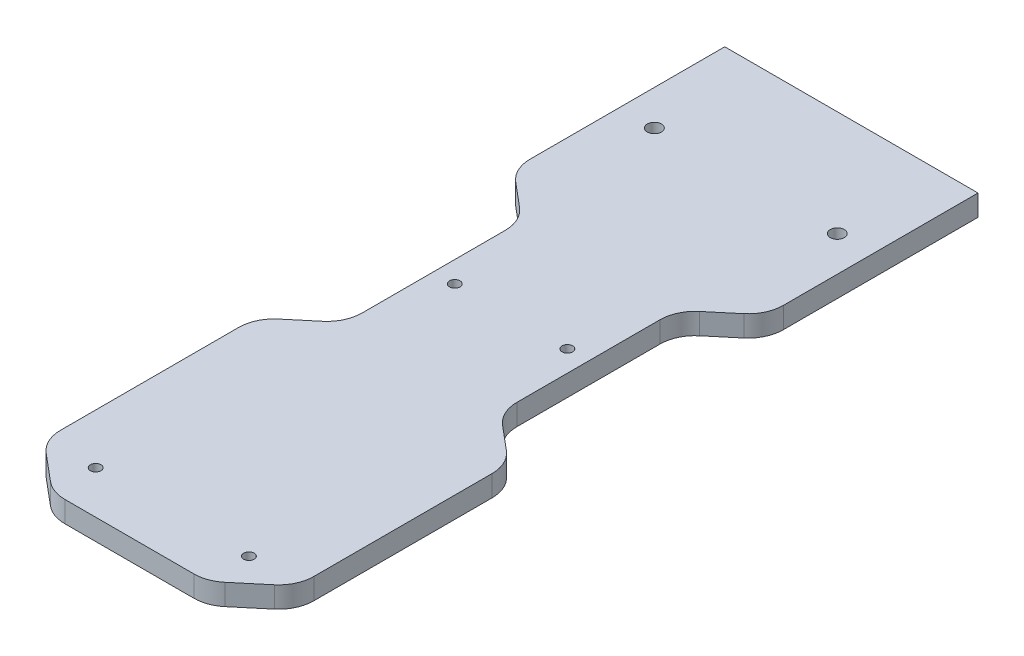
ISO-10303-21;
HEADER;
FILE_DESCRIPTION(('STEP AP214'),'2;1');
FILE_NAME('part.step','',(''),(''),'','','');
FILE_SCHEMA(('AUTOMOTIVE_DESIGN { 1 0 10303 214 1 1 1 1 }'));
ENDSEC;
DATA;
#1=APPLICATION_CONTEXT('core data for automotive mechanical design processes');
#2=APPLICATION_PROTOCOL_DEFINITION('international standard','automotive_design',2000,#1);
#3=PRODUCT_CONTEXT('',#1,'mechanical');
#4=PRODUCT('Part','Part','',(#3));
#5=PRODUCT_RELATED_PRODUCT_CATEGORY('part','',(#4));
#6=PRODUCT_DEFINITION_FORMATION('','',#4);
#7=PRODUCT_DEFINITION_CONTEXT('part definition',#1,'design');
#8=PRODUCT_DEFINITION('design','',#6,#7);
#9=PRODUCT_DEFINITION_SHAPE('','',#8);
#10=(LENGTH_UNIT() NAMED_UNIT(*) SI_UNIT(.MILLI.,.METRE.));
#11=(NAMED_UNIT(*) PLANE_ANGLE_UNIT() SI_UNIT($,.RADIAN.));
#12=(NAMED_UNIT(*) SI_UNIT($,.STERADIAN.) SOLID_ANGLE_UNIT());
#13=UNCERTAINTY_MEASURE_WITH_UNIT(LENGTH_MEASURE(1.E-05),#10,'distance_accuracy_value','');
#14=(GEOMETRIC_REPRESENTATION_CONTEXT(3) GLOBAL_UNCERTAINTY_ASSIGNED_CONTEXT((#13)) GLOBAL_UNIT_ASSIGNED_CONTEXT((#10,
#11,#12)) REPRESENTATION_CONTEXT('',''));
#15=CARTESIAN_POINT('',(0.,0.,0.));
#16=DIRECTION('',(0.,0.,1.));
#17=DIRECTION('',(1.,0.,0.));
#18=AXIS2_PLACEMENT_3D('',#15,#16,#17);
#19=CARTESIAN_POINT('',(-22.7869169844529,6.,102.227633762496));
#20=DIRECTION('',(0.,0.,-1.));
#21=DIRECTION('',(-1.,0.,0.));
#22=AXIS2_PLACEMENT_3D('',#19,#20,#21);
#23=PLANE('',#22);
#24=DIRECTION('',(1.,0.,0.));
#25=VECTOR('',#24,1.);
#26=CARTESIAN_POINT('',(-22.7869169844529,0.,102.227633762496));
#27=LINE('',#26,#25);
#28=CARTESIAN_POINT('',(-19.1472146417909,0.,102.227633762496));
#29=VERTEX_POINT('',#28);
#30=CARTESIAN_POINT('',(17.573380672885,0.,102.227633762496));
#31=VERTEX_POINT('',#30);
#32=EDGE_CURVE('E251',#29,#31,#27,.T.);
#33=ORIENTED_EDGE('',*,*,#32,.T.);
#34=DIRECTION('',(0.,-1.,0.));
#35=VECTOR('',#34,1.);
#36=CARTESIAN_POINT('',(17.573380672885,6.,102.227633762496));
#37=LINE('',#36,#35);
#38=CARTESIAN_POINT('',(17.573380672885,6.,102.227633762496));
#39=VERTEX_POINT('',#38);
#40=EDGE_CURVE('E348',#31,#39,#37,.F.);
#41=ORIENTED_EDGE('',*,*,#40,.T.);
#42=DIRECTION('',(1.,0.,0.));
#43=VECTOR('',#42,1.);
#44=CARTESIAN_POINT('',(-22.7869169844529,6.,102.227633762496));
#45=LINE('',#44,#43);
#46=CARTESIAN_POINT('',(-19.1472146417909,6.,102.227633762496));
#47=VERTEX_POINT('',#46);
#48=EDGE_CURVE('E289',#47,#39,#45,.T.);
#49=ORIENTED_EDGE('',*,*,#48,.F.);
#50=DIRECTION('',(0.,-1.,0.));
#51=VECTOR('',#50,1.);
#52=CARTESIAN_POINT('',(-19.1472146417909,6.,102.227633762496));
#53=LINE('',#52,#51);
#54=EDGE_CURVE('E345',#47,#29,#53,.T.);
#55=ORIENTED_EDGE('',*,*,#54,.T.);
#56=EDGE_LOOP('',(#33,#41,#49,#55));
#57=FACE_BOUND('',#56,.T.);
#58=ADVANCED_FACE('F32',(#57),#23,.F.);
#59=CARTESIAN_POINT('',(21.2130830155471,6.,102.227633762496));
#60=DIRECTION('',(-0.642787609686539,0.,-0.766044443118979));
#61=DIRECTION('',(-0.766044443118979,0.,0.642787609686539));
#62=AXIS2_PLACEMENT_3D('',#59,#60,#61);
#63=PLANE('',#62);
#64=DIRECTION('',(0.766044443118978,0.,-0.642787609686539));
#65=VECTOR('',#64,1.);
#66=CARTESIAN_POINT('',(21.2130830155471,0.,102.227633762496));
#67=LINE('',#66,#65);
#68=CARTESIAN_POINT('',(24.0012567697504,0.,99.8880781936862));
#69=VERTEX_POINT('',#68);
#70=CARTESIAN_POINT('',(31.6409591124124,0.,93.4776067756543));
#71=VERTEX_POINT('',#70);
#72=EDGE_CURVE('E254',#69,#71,#67,.T.);
#73=ORIENTED_EDGE('',*,*,#72,.T.);
#74=DIRECTION('',(0.,-1.,0.));
#75=VECTOR('',#74,1.);
#76=CARTESIAN_POINT('',(31.6409591124124,6.,93.4776067756543));
#77=LINE('',#76,#75);
#78=CARTESIAN_POINT('',(31.6409591124124,6.,93.4776067756543));
#79=VERTEX_POINT('',#78);
#80=EDGE_CURVE('E343',#71,#79,#77,.F.);
#81=ORIENTED_EDGE('',*,*,#80,.T.);
#82=DIRECTION('',(0.766044443118978,0.,-0.642787609686539));
#83=VECTOR('',#82,1.);
#84=CARTESIAN_POINT('',(21.2130830155471,6.,102.227633762496));
#85=LINE('',#84,#83);
#86=CARTESIAN_POINT('',(24.0012567697504,6.,99.8880781936862));
#87=VERTEX_POINT('',#86);
#88=EDGE_CURVE('E423',#87,#79,#85,.T.);
#89=ORIENTED_EDGE('',*,*,#88,.F.);
#90=DIRECTION('',(0.,-1.,0.));
#91=VECTOR('',#90,1.);
#92=CARTESIAN_POINT('',(24.0012567697504,6.,99.8880781936862));
#93=LINE('',#92,#91);
#94=EDGE_CURVE('E340',#87,#69,#93,.T.);
#95=ORIENTED_EDGE('',*,*,#94,.T.);
#96=EDGE_LOOP('',(#73,#81,#89,#95));
#97=FACE_BOUND('',#96,.T.);
#98=ADVANCED_FACE('F502',(#97),#63,.F.);
#99=CARTESIAN_POINT('',(35.213083015547,6.,90.4802389260145));
#100=DIRECTION('',(-1.,0.,0.));
#101=DIRECTION('',(0.,0.,1.));
#102=AXIS2_PLACEMENT_3D('',#99,#100,#101);
#103=PLANE('',#102);
#104=DIRECTION('',(0.,0.,-1.));
#105=VECTOR('',#104,1.);
#106=CARTESIAN_POINT('',(35.213083015547,0.,90.4802389260145));
#107=LINE('',#106,#105);
#108=CARTESIAN_POINT('',(35.213083015547,0.,85.8171623444645));
#109=VERTEX_POINT('',#108);
#110=CARTESIAN_POINT('',(35.2130830155471,0.,35.1433155075645));
#111=VERTEX_POINT('',#110);
#112=EDGE_CURVE('E258',#109,#111,#107,.T.);
#113=ORIENTED_EDGE('',*,*,#112,.T.);
#114=DIRECTION('',(0.,-1.,0.));
#115=VECTOR('',#114,1.);
#116=CARTESIAN_POINT('',(35.2130830155471,6.,35.1433155075645));
#117=LINE('',#116,#115);
#118=CARTESIAN_POINT('',(35.2130830155471,6.,35.1433155075645));
#119=VERTEX_POINT('',#118);
#120=EDGE_CURVE('E310',#111,#119,#117,.F.);
#121=ORIENTED_EDGE('',*,*,#120,.T.);
#122=DIRECTION('',(0.,0.,-1.));
#123=VECTOR('',#122,1.);
#124=CARTESIAN_POINT('',(35.213083015547,6.,90.4802389260145));
#125=LINE('',#124,#123);
#126=CARTESIAN_POINT('',(35.213083015547,6.,85.8171623444645));
#127=VERTEX_POINT('',#126);
#128=EDGE_CURVE('E426',#127,#119,#125,.T.);
#129=ORIENTED_EDGE('',*,*,#128,.F.);
#130=DIRECTION('',(0.,-1.,0.));
#131=VECTOR('',#130,1.);
#132=CARTESIAN_POINT('',(35.213083015547,6.,85.8171623444645));
#133=LINE('',#132,#131);
#134=EDGE_CURVE('E307',#127,#109,#133,.T.);
#135=ORIENTED_EDGE('',*,*,#134,.T.);
#136=EDGE_LOOP('',(#113,#121,#129,#135));
#137=FACE_BOUND('',#136,.T.);
#138=ADVANCED_FACE('F511',(#137),#103,.F.);
#139=CARTESIAN_POINT('',(35.2130830155471,6.,30.4802389260145));
#140=DIRECTION('',(-0.642787609686539,0.,0.766044443118978));
#141=DIRECTION('',(0.766044443118978,0.,0.642787609686539));
#142=AXIS2_PLACEMENT_3D('',#139,#140,#141);
#143=PLANE('',#142);
#144=DIRECTION('',(-0.766044443118978,0.,-0.642787609686539));
#145=VECTOR('',#144,1.);
#146=CARTESIAN_POINT('',(35.2130830155471,6.,30.4802389260145));
#147=LINE('',#146,#145);
#148=CARTESIAN_POINT('',(31.6409591124125,6.,27.4828710763747));
#149=VERTEX_POINT('',#148);
#150=CARTESIAN_POINT('',(24.7852069186817,6.,21.7302119391724));
#151=VERTEX_POINT('',#150);
#152=EDGE_CURVE('E429',#149,#151,#147,.T.);
#153=ORIENTED_EDGE('',*,*,#152,.F.);
#154=DIRECTION('',(0.,-1.,0.));
#155=VECTOR('',#154,1.);
#156=CARTESIAN_POINT('',(31.6409591124125,6.,27.4828710763747));
#157=LINE('',#156,#155);
#158=CARTESIAN_POINT('',(31.6409591124125,0.,27.4828710763747));
#159=VERTEX_POINT('',#158);
#160=EDGE_CURVE('E292',#149,#159,#157,.T.);
#161=ORIENTED_EDGE('',*,*,#160,.T.);
#162=DIRECTION('',(-0.766044443118978,0.,-0.642787609686539));
#163=VECTOR('',#162,1.);
#164=CARTESIAN_POINT('',(35.2130830155471,0.,30.4802389260145));
#165=LINE('',#164,#163);
#166=CARTESIAN_POINT('',(24.7852069186817,0.,21.7302119391724));
#167=VERTEX_POINT('',#166);
#168=EDGE_CURVE('E261',#159,#167,#165,.T.);
#169=ORIENTED_EDGE('',*,*,#168,.T.);
#170=DIRECTION('',(0.,-1.,0.));
#171=VECTOR('',#170,1.);
#172=CARTESIAN_POINT('',(24.7852069186817,6.,21.7302119391724));
#173=LINE('',#172,#171);
#174=EDGE_CURVE('E227',#167,#151,#173,.F.);
#175=ORIENTED_EDGE('',*,*,#174,.T.);
#176=EDGE_LOOP('',(#153,#161,#169,#175));
#177=FACE_BOUND('',#176,.T.);
#178=ADVANCED_FACE('F520',(#177),#143,.F.);
#179=CARTESIAN_POINT('',(21.2130830155471,6.,18.7328440895326));
#180=DIRECTION('',(-1.,0.,0.));
#181=DIRECTION('',(0.,0.,1.));
#182=AXIS2_PLACEMENT_3D('',#179,#180,#181);
#183=PLANE('',#182);
#184=DIRECTION('',(0.,0.,-1.));
#185=VECTOR('',#184,1.);
#186=CARTESIAN_POINT('',(21.2130830155471,0.,18.7328440895326));
#187=LINE('',#186,#185);
#188=CARTESIAN_POINT('',(21.2130830155471,0.,14.0697675079826));
#189=VERTEX_POINT('',#188);
#190=CARTESIAN_POINT('',(21.2130830155471,0.,-26.6040793289174));
#191=VERTEX_POINT('',#190);
#192=EDGE_CURVE('E264',#189,#191,#187,.T.);
#193=ORIENTED_EDGE('',*,*,#192,.T.);
#194=DIRECTION('',(0.,-1.,0.));
#195=VECTOR('',#194,1.);
#196=CARTESIAN_POINT('',(21.2130830155471,6.,-26.6040793289174));
#197=LINE('',#196,#195);
#198=CARTESIAN_POINT('',(21.2130830155471,6.,-26.6040793289174));
#199=VERTEX_POINT('',#198);
#200=EDGE_CURVE('E384',#191,#199,#197,.F.);
#201=ORIENTED_EDGE('',*,*,#200,.T.);
#202=DIRECTION('',(0.,0.,-1.));
#203=VECTOR('',#202,1.);
#204=CARTESIAN_POINT('',(21.2130830155471,6.,18.7328440895326));
#205=LINE('',#204,#203);
#206=CARTESIAN_POINT('',(21.2130830155471,6.,14.0697675079826));
#207=VERTEX_POINT('',#206);
#208=EDGE_CURVE('E432',#207,#199,#205,.T.);
#209=ORIENTED_EDGE('',*,*,#208,.F.);
#210=DIRECTION('',(0.,-1.,0.));
#211=VECTOR('',#210,1.);
#212=CARTESIAN_POINT('',(21.2130830155471,0.,14.0697675079826));
#213=LINE('',#212,#211);
#214=EDGE_CURVE('E324',#207,#189,#213,.T.);
#215=ORIENTED_EDGE('',*,*,#214,.T.);
#216=EDGE_LOOP('',(#193,#201,#209,#215));
#217=FACE_BOUND('',#216,.T.);
#218=ADVANCED_FACE('F528',(#217),#183,.F.);
#219=CARTESIAN_POINT('',(21.2130830155471,6.,-31.2671559104674));
#220=DIRECTION('',(-0.642787609686539,0.,-0.766044443118978));
#221=DIRECTION('',(-0.766044443118978,0.,0.642787609686539));
#222=AXIS2_PLACEMENT_3D('',#219,#220,#221);
#223=PLANE('',#222);
#224=DIRECTION('',(0.766044443118978,0.,-0.642787609686539));
#225=VECTOR('',#224,1.);
#226=CARTESIAN_POINT('',(21.2130830155471,0.,-31.2671559104674));
#227=LINE('',#226,#225);
#228=CARTESIAN_POINT('',(24.7852069186817,0.,-34.2645237601072));
#229=VERTEX_POINT('',#228);
#230=CARTESIAN_POINT('',(31.6409591124124,0.,-40.0171828973095));
#231=VERTEX_POINT('',#230);
#232=EDGE_CURVE('E267',#229,#231,#227,.T.);
#233=ORIENTED_EDGE('',*,*,#232,.T.);
#234=DIRECTION('',(0.,-1.,0.));
#235=VECTOR('',#234,1.);
#236=CARTESIAN_POINT('',(31.6409591124124,6.,-40.0171828973095));
#237=LINE('',#236,#235);
#238=CARTESIAN_POINT('',(31.6409591124124,6.,-40.0171828973095));
#239=VERTEX_POINT('',#238);
#240=EDGE_CURVE('E373',#231,#239,#237,.F.);
#241=ORIENTED_EDGE('',*,*,#240,.T.);
#242=DIRECTION('',(0.766044443118978,0.,-0.642787609686539));
#243=VECTOR('',#242,1.);
#244=CARTESIAN_POINT('',(21.2130830155471,6.,-31.2671559104674));
#245=LINE('',#244,#243);
#246=CARTESIAN_POINT('',(24.7852069186817,6.,-34.2645237601072));
#247=VERTEX_POINT('',#246);
#248=EDGE_CURVE('E218',#247,#239,#245,.T.);
#249=ORIENTED_EDGE('',*,*,#248,.F.);
#250=DIRECTION('',(0.,-1.,0.));
#251=VECTOR('',#250,1.);
#252=CARTESIAN_POINT('',(24.7852069186817,0.,-34.2645237601072));
#253=LINE('',#252,#251);
#254=EDGE_CURVE('E370',#247,#229,#253,.T.);
#255=ORIENTED_EDGE('',*,*,#254,.T.);
#256=EDGE_LOOP('',(#233,#241,#249,#255));
#257=FACE_BOUND('',#256,.T.);
#258=ADVANCED_FACE('F533',(#257),#223,.F.);
#259=CARTESIAN_POINT('',(35.213083015547,6.,-43.0145507469493));
#260=DIRECTION('',(-1.,0.,0.));
#261=DIRECTION('',(0.,0.,1.));
#262=AXIS2_PLACEMENT_3D('',#259,#260,#261);
#263=PLANE('',#262);
#264=DIRECTION('',(0.,0.,-1.));
#265=VECTOR('',#264,1.);
#266=CARTESIAN_POINT('',(35.213083015547,6.,-43.0145507469493));
#267=LINE('',#266,#265);
#268=CARTESIAN_POINT('',(35.213083015547,6.,-47.6776273284993));
#269=VERTEX_POINT('',#268);
#270=CARTESIAN_POINT('',(35.213083015547,6.,-103.014550746949));
#271=VERTEX_POINT('',#270);
#272=EDGE_CURVE('E205',#269,#271,#267,.T.);
#273=ORIENTED_EDGE('',*,*,#272,.F.);
#274=DIRECTION('',(0.,-1.,0.));
#275=VECTOR('',#274,1.);
#276=CARTESIAN_POINT('',(35.213083015547,6.,-47.6776273284993));
#277=LINE('',#276,#275);
#278=CARTESIAN_POINT('',(35.213083015547,0.,-47.6776273284993));
#279=VERTEX_POINT('',#278);
#280=EDGE_CURVE('E364',#269,#279,#277,.T.);
#281=ORIENTED_EDGE('',*,*,#280,.T.);
#282=DIRECTION('',(0.,0.,-1.));
#283=VECTOR('',#282,1.);
#284=CARTESIAN_POINT('',(35.213083015547,0.,-43.0145507469493));
#285=LINE('',#284,#283);
#286=CARTESIAN_POINT('',(35.213083015547,0.,-103.014550746949));
#287=VERTEX_POINT('',#286);
#288=EDGE_CURVE('E224',#279,#287,#285,.T.);
#289=ORIENTED_EDGE('',*,*,#288,.T.);
#290=DIRECTION('',(0.,-1.,0.));
#291=VECTOR('',#290,1.);
#292=CARTESIAN_POINT('',(35.213083015547,6.,-103.014550746949));
#293=LINE('',#292,#291);
#294=EDGE_CURVE('E221',#271,#287,#293,.T.);
#295=ORIENTED_EDGE('',*,*,#294,.F.);
#296=EDGE_LOOP('',(#273,#281,#289,#295));
#297=FACE_BOUND('',#296,.T.);
#298=ADVANCED_FACE('F222',(#297),#263,.F.);
#299=CARTESIAN_POINT('',(35.213083015547,6.,-103.014550746949));
#300=DIRECTION('',(0.,0.,1.));
#301=DIRECTION('',(1.,0.,0.));
#302=AXIS2_PLACEMENT_3D('',#299,#300,#301);
#303=PLANE('',#302);
#304=DIRECTION('',(-1.,0.,0.));
#305=VECTOR('',#304,1.);
#306=CARTESIAN_POINT('',(35.213083015547,0.,-103.014550746949));
#307=LINE('',#306,#305);
#308=CARTESIAN_POINT('',(-36.7869169844529,0.,-103.014550746949));
#309=VERTEX_POINT('',#308);
#310=EDGE_CURVE('E271',#287,#309,#307,.T.);
#311=ORIENTED_EDGE('',*,*,#310,.T.);
#312=DIRECTION('',(0.,-1.,0.));
#313=VECTOR('',#312,1.);
#314=CARTESIAN_POINT('',(-36.7869169844529,6.,-103.014550746949));
#315=LINE('',#314,#313);
#316=CARTESIAN_POINT('',(-36.7869169844529,6.,-103.014550746949));
#317=VERTEX_POINT('',#316);
#318=EDGE_CURVE('E228',#317,#309,#315,.T.);
#319=ORIENTED_EDGE('',*,*,#318,.F.);
#320=DIRECTION('',(-1.,0.,0.));
#321=VECTOR('',#320,1.);
#322=CARTESIAN_POINT('',(35.213083015547,6.,-103.014550746949));
#323=LINE('',#322,#321);
#324=EDGE_CURVE('E211',#271,#317,#323,.T.);
#325=ORIENTED_EDGE('',*,*,#324,.F.);
#326=ORIENTED_EDGE('',*,*,#294,.T.);
#327=EDGE_LOOP('',(#311,#319,#325,#326));
#328=FACE_BOUND('',#327,.T.);
#329=ADVANCED_FACE('F230',(#328),#303,.F.);
#330=CARTESIAN_POINT('',(-36.7869169844529,6.,-103.014550746949));
#331=DIRECTION('',(1.,0.,0.));
#332=DIRECTION('',(0.,0.,-1.));
#333=AXIS2_PLACEMENT_3D('',#330,#331,#332);
#334=PLANE('',#333);
#335=DIRECTION('',(0.,0.,1.));
#336=VECTOR('',#335,1.);
#337=CARTESIAN_POINT('',(-36.7869169844529,0.,-103.014550746949));
#338=LINE('',#337,#336);
#339=CARTESIAN_POINT('',(-36.7869169844529,0.,-47.6776273284993));
#340=VERTEX_POINT('',#339);
#341=EDGE_CURVE('E273',#309,#340,#338,.T.);
#342=ORIENTED_EDGE('',*,*,#341,.T.);
#343=DIRECTION('',(0.,-1.,0.));
#344=VECTOR('',#343,1.);
#345=CARTESIAN_POINT('',(-36.7869169844529,6.,-47.6776273284993));
#346=LINE('',#345,#344);
#347=CARTESIAN_POINT('',(-36.7869169844529,6.,-47.6776273284993));
#348=VERTEX_POINT('',#347);
#349=EDGE_CURVE('E382',#340,#348,#346,.F.);
#350=ORIENTED_EDGE('',*,*,#349,.T.);
#351=DIRECTION('',(0.,0.,1.));
#352=VECTOR('',#351,1.);
#353=CARTESIAN_POINT('',(-36.7869169844529,6.,-103.014550746949));
#354=LINE('',#353,#352);
#355=EDGE_CURVE('E233',#317,#348,#354,.T.);
#356=ORIENTED_EDGE('',*,*,#355,.F.);
#357=ORIENTED_EDGE('',*,*,#318,.T.);
#358=EDGE_LOOP('',(#342,#350,#356,#357));
#359=FACE_BOUND('',#358,.T.);
#360=ADVANCED_FACE('F446',(#359),#334,.F.);
#361=CARTESIAN_POINT('',(-36.7869169844529,6.,-43.0145507469493));
#362=DIRECTION('',(0.642787609686539,0.,-0.766044443118978));
#363=DIRECTION('',(-0.766044443118978,0.,-0.642787609686539));
#364=AXIS2_PLACEMENT_3D('',#361,#362,#363);
#365=PLANE('',#364);
#366=DIRECTION('',(0.766044443118979,0.,0.642787609686539));
#367=VECTOR('',#366,1.);
#368=CARTESIAN_POINT('',(-36.7869169844529,6.,-43.0145507469493));
#369=LINE('',#368,#367);
#370=CARTESIAN_POINT('',(-33.2147930813183,6.,-40.0171828973095));
#371=VERTEX_POINT('',#370);
#372=CARTESIAN_POINT('',(-26.3590408875875,6.,-34.2645237601072));
#373=VERTEX_POINT('',#372);
#374=EDGE_CURVE('E235',#371,#373,#369,.T.);
#375=ORIENTED_EDGE('',*,*,#374,.F.);
#376=DIRECTION('',(0.,-1.,0.));
#377=VECTOR('',#376,1.);
#378=CARTESIAN_POINT('',(-33.2147930813183,6.,-40.0171828973095));
#379=LINE('',#378,#377);
#380=CARTESIAN_POINT('',(-33.2147930813183,0.,-40.0171828973095));
#381=VERTEX_POINT('',#380);
#382=EDGE_CURVE('E379',#371,#381,#379,.T.);
#383=ORIENTED_EDGE('',*,*,#382,.T.);
#384=DIRECTION('',(0.766044443118979,0.,0.642787609686539));
#385=VECTOR('',#384,1.);
#386=CARTESIAN_POINT('',(-36.7869169844529,0.,-43.0145507469493));
#387=LINE('',#386,#385);
#388=CARTESIAN_POINT('',(-26.3590408875875,0.,-34.2645237601072));
#389=VERTEX_POINT('',#388);
#390=EDGE_CURVE('E276',#381,#389,#387,.T.);
#391=ORIENTED_EDGE('',*,*,#390,.T.);
#392=DIRECTION('',(0.,-1.,0.));
#393=VECTOR('',#392,1.);
#394=CARTESIAN_POINT('',(-26.3590408875875,6.,-34.2645237601072));
#395=LINE('',#394,#393);
#396=EDGE_CURVE('E55',#389,#373,#395,.F.);
#397=ORIENTED_EDGE('',*,*,#396,.T.);
#398=EDGE_LOOP('',(#375,#383,#391,#397));
#399=FACE_BOUND('',#398,.T.);
#400=ADVANCED_FACE('F453',(#399),#365,.F.);
#401=CARTESIAN_POINT('',(-22.7869169844529,6.,-31.2671559104674));
#402=DIRECTION('',(1.,0.,0.));
#403=DIRECTION('',(0.,0.,-1.));
#404=AXIS2_PLACEMENT_3D('',#401,#402,#403);
#405=PLANE('',#404);
#406=DIRECTION('',(0.,0.,1.));
#407=VECTOR('',#406,1.);
#408=CARTESIAN_POINT('',(-22.7869169844529,6.,-31.2671559104674));
#409=LINE('',#408,#407);
#410=CARTESIAN_POINT('',(-22.7869169844529,6.,-26.6040793289174));
#411=VERTEX_POINT('',#410);
#412=CARTESIAN_POINT('',(-22.7869169844529,6.,14.0697675079826));
#413=VERTEX_POINT('',#412);
#414=EDGE_CURVE('E240',#411,#413,#409,.T.);
#415=ORIENTED_EDGE('',*,*,#414,.F.);
#416=DIRECTION('',(0.,-1.,0.));
#417=VECTOR('',#416,1.);
#418=CARTESIAN_POINT('',(-22.7869169844529,0.,-26.6040793289174));
#419=LINE('',#418,#417);
#420=CARTESIAN_POINT('',(-22.7869169844529,0.,-26.6040793289174));
#421=VERTEX_POINT('',#420);
#422=EDGE_CURVE('E386',#411,#421,#419,.T.);
#423=ORIENTED_EDGE('',*,*,#422,.T.);
#424=DIRECTION('',(0.,0.,1.));
#425=VECTOR('',#424,1.);
#426=CARTESIAN_POINT('',(-22.7869169844529,0.,-31.2671559104674));
#427=LINE('',#426,#425);
#428=CARTESIAN_POINT('',(-22.7869169844529,0.,14.0697675079826));
#429=VERTEX_POINT('',#428);
#430=EDGE_CURVE('E278',#421,#429,#427,.T.);
#431=ORIENTED_EDGE('',*,*,#430,.T.);
#432=DIRECTION('',(0.,-1.,0.));
#433=VECTOR('',#432,1.);
#434=CARTESIAN_POINT('',(-22.7869169844529,6.,14.0697675079826));
#435=LINE('',#434,#433);
#436=EDGE_CURVE('E332',#429,#413,#435,.F.);
#437=ORIENTED_EDGE('',*,*,#436,.T.);
#438=EDGE_LOOP('',(#415,#423,#431,#437));
#439=FACE_BOUND('',#438,.T.);
#440=ADVANCED_FACE('F458',(#439),#405,.F.);
#441=CARTESIAN_POINT('',(-22.7869169844529,6.,18.7328440895326));
#442=DIRECTION('',(0.642787609686539,0.,0.766044443118978));
#443=DIRECTION('',(0.766044443118978,0.,-0.642787609686539));
#444=AXIS2_PLACEMENT_3D('',#441,#442,#443);
#445=PLANE('',#444);
#446=DIRECTION('',(-0.766044443118978,0.,0.642787609686539));
#447=VECTOR('',#446,1.);
#448=CARTESIAN_POINT('',(-22.7869169844529,6.,18.7328440895326));
#449=LINE('',#448,#447);
#450=CARTESIAN_POINT('',(-26.3590408875876,6.,21.7302119391724));
#451=VERTEX_POINT('',#450);
#452=CARTESIAN_POINT('',(-33.2147930813183,6.,27.4828710763747));
#453=VERTEX_POINT('',#452);
#454=EDGE_CURVE('E242',#451,#453,#449,.T.);
#455=ORIENTED_EDGE('',*,*,#454,.F.);
#456=DIRECTION('',(0.,-1.,0.));
#457=VECTOR('',#456,1.);
#458=CARTESIAN_POINT('',(-26.3590408875876,0.,21.7302119391724));
#459=LINE('',#458,#457);
#460=CARTESIAN_POINT('',(-26.3590408875876,0.,21.7302119391724));
#461=VERTEX_POINT('',#460);
#462=EDGE_CURVE('E329',#451,#461,#459,.T.);
#463=ORIENTED_EDGE('',*,*,#462,.T.);
#464=DIRECTION('',(-0.766044443118978,0.,0.642787609686539));
#465=VECTOR('',#464,1.);
#466=CARTESIAN_POINT('',(-22.7869169844529,0.,18.7328440895326));
#467=LINE('',#466,#465);
#468=CARTESIAN_POINT('',(-33.2147930813183,0.,27.4828710763747));
#469=VERTEX_POINT('',#468);
#470=EDGE_CURVE('E280',#461,#469,#467,.T.);
#471=ORIENTED_EDGE('',*,*,#470,.T.);
#472=DIRECTION('',(0.,-1.,0.));
#473=VECTOR('',#472,1.);
#474=CARTESIAN_POINT('',(-33.2147930813183,6.,27.4828710763747));
#475=LINE('',#474,#473);
#476=EDGE_CURVE('E327',#469,#453,#475,.F.);
#477=ORIENTED_EDGE('',*,*,#476,.T.);
#478=EDGE_LOOP('',(#455,#463,#471,#477));
#479=FACE_BOUND('',#478,.T.);
#480=ADVANCED_FACE('F466',(#479),#445,.F.);
#481=CARTESIAN_POINT('',(-36.7869169844529,6.,30.4802389260145));
#482=DIRECTION('',(1.,0.,0.));
#483=DIRECTION('',(0.,0.,-1.));
#484=AXIS2_PLACEMENT_3D('',#481,#482,#483);
#485=PLANE('',#484);
#486=DIRECTION('',(0.,0.,1.));
#487=VECTOR('',#486,1.);
#488=CARTESIAN_POINT('',(-36.7869169844529,6.,30.4802389260145));
#489=LINE('',#488,#487);
#490=CARTESIAN_POINT('',(-36.7869169844529,6.,35.1433155075645));
#491=VERTEX_POINT('',#490);
#492=CARTESIAN_POINT('',(-36.7869169844529,6.,85.8171623444645));
#493=VERTEX_POINT('',#492);
#494=EDGE_CURVE('E245',#491,#493,#489,.T.);
#495=ORIENTED_EDGE('',*,*,#494,.F.);
#496=DIRECTION('',(0.,-1.,0.));
#497=VECTOR('',#496,1.);
#498=CARTESIAN_POINT('',(-36.7869169844529,6.,35.1433155075645));
#499=LINE('',#498,#497);
#500=CARTESIAN_POINT('',(-36.7869169844529,0.,35.1433155075645));
#501=VERTEX_POINT('',#500);
#502=EDGE_CURVE('E337',#491,#501,#499,.T.);
#503=ORIENTED_EDGE('',*,*,#502,.T.);
#504=DIRECTION('',(0.,0.,1.));
#505=VECTOR('',#504,1.);
#506=CARTESIAN_POINT('',(-36.7869169844529,0.,30.4802389260145));
#507=LINE('',#506,#505);
#508=CARTESIAN_POINT('',(-36.7869169844529,0.,85.8171623444645));
#509=VERTEX_POINT('',#508);
#510=EDGE_CURVE('E283',#501,#509,#507,.T.);
#511=ORIENTED_EDGE('',*,*,#510,.T.);
#512=DIRECTION('',(0.,-1.,0.));
#513=VECTOR('',#512,1.);
#514=CARTESIAN_POINT('',(-36.7869169844529,6.,85.8171623444645));
#515=LINE('',#514,#513);
#516=EDGE_CURVE('E335',#509,#493,#515,.F.);
#517=ORIENTED_EDGE('',*,*,#516,.T.);
#518=EDGE_LOOP('',(#495,#503,#511,#517));
#519=FACE_BOUND('',#518,.T.);
#520=ADVANCED_FACE('F477',(#519),#485,.F.);
#521=CARTESIAN_POINT('',(-36.7869169844529,6.,90.4802389260145));
#522=DIRECTION('',(0.642787609686539,0.,-0.766044443118978));
#523=DIRECTION('',(-0.766044443118978,0.,-0.642787609686539));
#524=AXIS2_PLACEMENT_3D('',#521,#522,#523);
#525=PLANE('',#524);
#526=DIRECTION('',(0.766044443118978,0.,0.642787609686539));
#527=VECTOR('',#526,1.);
#528=CARTESIAN_POINT('',(-36.7869169844529,0.,90.4802389260145));
#529=LINE('',#528,#527);
#530=CARTESIAN_POINT('',(-33.2147930813183,0.,93.4776067756543));
#531=VERTEX_POINT('',#530);
#532=CARTESIAN_POINT('',(-25.5750907386563,0.,99.8880781936862));
#533=VERTEX_POINT('',#532);
#534=EDGE_CURVE('E286',#531,#533,#529,.T.);
#535=ORIENTED_EDGE('',*,*,#534,.T.);
#536=DIRECTION('',(0.,-1.,0.));
#537=VECTOR('',#536,1.);
#538=CARTESIAN_POINT('',(-25.5750907386563,6.,99.8880781936862));
#539=LINE('',#538,#537);
#540=CARTESIAN_POINT('',(-25.5750907386563,6.,99.8880781936862));
#541=VERTEX_POINT('',#540);
#542=EDGE_CURVE('E353',#533,#541,#539,.F.);
#543=ORIENTED_EDGE('',*,*,#542,.T.);
#544=DIRECTION('',(0.766044443118978,0.,0.642787609686539));
#545=VECTOR('',#544,1.);
#546=CARTESIAN_POINT('',(-36.7869169844529,6.,90.4802389260145));
#547=LINE('',#546,#545);
#548=CARTESIAN_POINT('',(-33.2147930813183,6.,93.4776067756543));
#549=VERTEX_POINT('',#548);
#550=EDGE_CURVE('E248',#549,#541,#547,.T.);
#551=ORIENTED_EDGE('',*,*,#550,.F.);
#552=DIRECTION('',(0.,-1.,0.));
#553=VECTOR('',#552,1.);
#554=CARTESIAN_POINT('',(-33.2147930813183,6.,93.4776067756543));
#555=LINE('',#554,#553);
#556=EDGE_CURVE('E350',#549,#531,#555,.T.);
#557=ORIENTED_EDGE('',*,*,#556,.T.);
#558=EDGE_LOOP('',(#535,#543,#551,#557));
#559=FACE_BOUND('',#558,.T.);
#560=ADVANCED_FACE('F485',(#559),#525,.F.);
#561=CARTESIAN_POINT('',(0.,6.,0.));
#562=DIRECTION('',(0.,1.,0.));
#563=DIRECTION('',(0.,0.,1.));
#564=AXIS2_PLACEMENT_3D('',#561,#562,#563);
#565=PLANE('',#564);
#566=CARTESIAN_POINT('',(-26.7869169844529,6.,-73.0145507469493));
#567=DIRECTION('',(0.,1.,0.));
#568=DIRECTION('',(0.,0.,1.));
#569=AXIS2_PLACEMENT_3D('',#566,#567,#568);
#570=CIRCLE('',#569,2.);
#571=CARTESIAN_POINT('',(-26.7869169844529,6.,-71.0145507469493));
#572=VERTEX_POINT('',#571);
#573=EDGE_CURVE('E412',#572,#572,#570,.T.);
#574=ORIENTED_EDGE('',*,*,#573,.F.);
#575=EDGE_LOOP('',(#574));
#576=FACE_BOUND('',#575,.T.);
#577=CARTESIAN_POINT('',(25.213083015547,6.,-73.0145507469493));
#578=DIRECTION('',(0.,1.,0.));
#579=DIRECTION('',(0.,0.,1.));
#580=AXIS2_PLACEMENT_3D('',#577,#578,#579);
#581=CIRCLE('',#580,2.);
#582=CARTESIAN_POINT('',(25.213083015547,6.,-71.0145507469493));
#583=VERTEX_POINT('',#582);
#584=EDGE_CURVE('E757',#583,#583,#581,.T.);
#585=ORIENTED_EDGE('',*,*,#584,.F.);
#586=EDGE_LOOP('',(#585));
#587=FACE_BOUND('',#586,.T.);
#588=CARTESIAN_POINT('',(20.9935821061417,6.,90.0433449618714));
#589=DIRECTION('',(0.,1.,0.));
#590=DIRECTION('',(0.,0.,1.));
#591=AXIS2_PLACEMENT_3D('',#588,#589,#590);
#592=CIRCLE('',#591,1.5);
#593=CARTESIAN_POINT('',(20.9935821061417,6.,91.5433449618714));
#594=VERTEX_POINT('',#593);
#595=EDGE_CURVE('E401',#594,#594,#592,.T.);
#596=ORIENTED_EDGE('',*,*,#595,.F.);
#597=EDGE_LOOP('',(#596));
#598=FACE_BOUND('',#597,.T.);
#599=CARTESIAN_POINT('',(-22.5674160750476,6.,90.0433449618714));
#600=DIRECTION('',(0.,1.,0.));
#601=DIRECTION('',(0.,0.,1.));
#602=AXIS2_PLACEMENT_3D('',#599,#600,#601);
#603=CIRCLE('',#602,1.5);
#604=CARTESIAN_POINT('',(-22.5674160750476,6.,91.5433449618714));
#605=VERTEX_POINT('',#604);
#606=EDGE_CURVE('E407',#605,#605,#603,.T.);
#607=ORIENTED_EDGE('',*,*,#606,.F.);
#608=EDGE_LOOP('',(#607));
#609=FACE_BOUND('',#608,.T.);
#610=CARTESIAN_POINT('',(15.2130830155471,6.,-6.26715591046739));
#611=DIRECTION('',(0.,1.,0.));
#612=DIRECTION('',(0.,0.,1.));
#613=AXIS2_PLACEMENT_3D('',#610,#611,#612);
#614=CIRCLE('',#613,1.5);
#615=CARTESIAN_POINT('',(15.2130830155471,6.,-4.76715591046739));
#616=VERTEX_POINT('',#615);
#617=EDGE_CURVE('E397',#616,#616,#614,.T.);
#618=ORIENTED_EDGE('',*,*,#617,.F.);
#619=EDGE_LOOP('',(#618));
#620=FACE_BOUND('',#619,.T.);
#621=CARTESIAN_POINT('',(-16.7869169844529,6.,-6.26715591046739));
#622=DIRECTION('',(0.,1.,0.));
#623=DIRECTION('',(0.,0.,1.));
#624=AXIS2_PLACEMENT_3D('',#621,#622,#623);
#625=CIRCLE('',#624,1.5);
#626=CARTESIAN_POINT('',(-16.7869169844529,6.,-4.76715591046739));
#627=VERTEX_POINT('',#626);
#628=EDGE_CURVE('E405',#627,#627,#625,.T.);
#629=ORIENTED_EDGE('',*,*,#628,.F.);
#630=EDGE_LOOP('',(#629));
#631=FACE_BOUND('',#630,.T.);
#632=ORIENTED_EDGE('',*,*,#248,.T.);
#633=CARTESIAN_POINT('',(25.213083015547,6.,-47.6776273284993));
#634=DIRECTION('',(0.,1.,0.));
#635=DIRECTION('',(0.,0.,1.));
#636=AXIS2_PLACEMENT_3D('',#633,#634,#635);
#637=CIRCLE('',#636,10.);
#638=EDGE_CURVE('E214',#239,#269,#637,.T.);
#639=ORIENTED_EDGE('',*,*,#638,.T.);
#640=ORIENTED_EDGE('',*,*,#272,.T.);
#641=ORIENTED_EDGE('',*,*,#324,.T.);
#642=ORIENTED_EDGE('',*,*,#355,.T.);
#643=CARTESIAN_POINT('',(-26.7869169844529,6.,-47.6776273284993));
#644=DIRECTION('',(0.,1.,0.));
#645=DIRECTION('',(0.,0.,1.));
#646=AXIS2_PLACEMENT_3D('',#643,#644,#645);
#647=CIRCLE('',#646,10.);
#648=EDGE_CURVE('E375',#348,#371,#647,.T.);
#649=ORIENTED_EDGE('',*,*,#648,.T.);
#650=ORIENTED_EDGE('',*,*,#374,.T.);
#651=CARTESIAN_POINT('',(-32.7869169844529,6.,-26.6040793289174));
#652=DIRECTION('',(0.,1.,0.));
#653=DIRECTION('',(0.,0.,1.));
#654=AXIS2_PLACEMENT_3D('',#651,#652,#653);
#655=CIRCLE('',#654,10.);
#656=EDGE_CURVE('E11',#373,#411,#655,.F.);
#657=ORIENTED_EDGE('',*,*,#656,.T.);
#658=ORIENTED_EDGE('',*,*,#414,.T.);
#659=CARTESIAN_POINT('',(-32.786916984453,6.,14.0697675079826));
#660=DIRECTION('',(0.,1.,0.));
#661=DIRECTION('',(0.,0.,1.));
#662=AXIS2_PLACEMENT_3D('',#659,#660,#661);
#663=CIRCLE('',#662,10.);
#664=EDGE_CURVE('E362',#413,#451,#663,.F.);
#665=ORIENTED_EDGE('',*,*,#664,.T.);
#666=ORIENTED_EDGE('',*,*,#454,.T.);
#667=CARTESIAN_POINT('',(-26.7869169844529,6.,35.1433155075645));
#668=DIRECTION('',(0.,1.,0.));
#669=DIRECTION('',(0.,0.,1.));
#670=AXIS2_PLACEMENT_3D('',#667,#668,#669);
#671=CIRCLE('',#670,10.);
#672=EDGE_CURVE('E320',#453,#491,#671,.T.);
#673=ORIENTED_EDGE('',*,*,#672,.T.);
#674=ORIENTED_EDGE('',*,*,#494,.T.);
#675=CARTESIAN_POINT('',(-26.7869169844529,6.,85.8171623444645));
#676=DIRECTION('',(0.,1.,0.));
#677=DIRECTION('',(0.,0.,1.));
#678=AXIS2_PLACEMENT_3D('',#675,#676,#677);
#679=CIRCLE('',#678,10.);
#680=EDGE_CURVE('E312',#493,#549,#679,.T.);
#681=ORIENTED_EDGE('',*,*,#680,.T.);
#682=ORIENTED_EDGE('',*,*,#550,.T.);
#683=CARTESIAN_POINT('',(-19.1472146417909,6.,92.2276337624964));
#684=DIRECTION('',(0.,1.,0.));
#685=DIRECTION('',(0.,0.,1.));
#686=AXIS2_PLACEMENT_3D('',#683,#684,#685);
#687=CIRCLE('',#686,10.);
#688=EDGE_CURVE('E314',#541,#47,#687,.T.);
#689=ORIENTED_EDGE('',*,*,#688,.T.);
#690=ORIENTED_EDGE('',*,*,#48,.T.);
#691=CARTESIAN_POINT('',(17.5733806728851,6.,92.2276337624964));
#692=DIRECTION('',(0.,1.,0.));
#693=DIRECTION('',(0.,0.,1.));
#694=AXIS2_PLACEMENT_3D('',#691,#692,#693);
#695=CIRCLE('',#694,10.);
#696=EDGE_CURVE('E316',#39,#87,#695,.T.);
#697=ORIENTED_EDGE('',*,*,#696,.T.);
#698=ORIENTED_EDGE('',*,*,#88,.T.);
#699=CARTESIAN_POINT('',(25.213083015547,6.,85.8171623444645));
#700=DIRECTION('',(0.,1.,0.));
#701=DIRECTION('',(0.,0.,1.));
#702=AXIS2_PLACEMENT_3D('',#699,#700,#701);
#703=CIRCLE('',#702,10.);
#704=EDGE_CURVE('E318',#79,#127,#703,.T.);
#705=ORIENTED_EDGE('',*,*,#704,.T.);
#706=ORIENTED_EDGE('',*,*,#128,.T.);
#707=CARTESIAN_POINT('',(25.2130830155471,6.,35.1433155075645));
#708=DIRECTION('',(0.,1.,0.));
#709=DIRECTION('',(0.,0.,1.));
#710=AXIS2_PLACEMENT_3D('',#707,#708,#709);
#711=CIRCLE('',#710,10.);
#712=EDGE_CURVE('E322',#119,#149,#711,.T.);
#713=ORIENTED_EDGE('',*,*,#712,.T.);
#714=ORIENTED_EDGE('',*,*,#152,.T.);
#715=CARTESIAN_POINT('',(31.2130830155471,6.,14.0697675079826));
#716=DIRECTION('',(0.,1.,0.));
#717=DIRECTION('',(0.,0.,1.));
#718=AXIS2_PLACEMENT_3D('',#715,#716,#717);
#719=CIRCLE('',#718,10.);
#720=EDGE_CURVE('E357',#151,#207,#719,.F.);
#721=ORIENTED_EDGE('',*,*,#720,.T.);
#722=ORIENTED_EDGE('',*,*,#208,.T.);
#723=CARTESIAN_POINT('',(31.2130830155471,6.,-26.6040793289174));
#724=DIRECTION('',(0.,1.,0.));
#725=DIRECTION('',(0.,0.,1.));
#726=AXIS2_PLACEMENT_3D('',#723,#724,#725);
#727=CIRCLE('',#726,10.);
#728=EDGE_CURVE('E391',#199,#247,#727,.F.);
#729=ORIENTED_EDGE('',*,*,#728,.T.);
#730=EDGE_LOOP('',(#632,#639,#640,#641,#642,#649,#650,#657,#658,#665,#666,#673,#674,#681,#682,
#689,#690,#697,#698,#705,#706,#713,#714,#721,#722,#729));
#731=FACE_BOUND('',#730,.T.);
#732=ADVANCED_FACE('F208',(#576,#587,#598,#609,#620,#631,#731),#565,.T.);
#733=CARTESIAN_POINT('',(0.,0.,0.));
#734=DIRECTION('',(0.,1.,0.));
#735=DIRECTION('',(0.,0.,1.));
#736=AXIS2_PLACEMENT_3D('',#733,#734,#735);
#737=PLANE('',#736);
#738=CARTESIAN_POINT('',(-26.7869169844529,0.,-73.0145507469493));
#739=DIRECTION('',(0.,-1.,0.));
#740=DIRECTION('',(0.,0.,-1.));
#741=AXIS2_PLACEMENT_3D('',#738,#739,#740);
#742=CIRCLE('',#741,2.);
#743=CARTESIAN_POINT('',(-26.7869169844529,0.,-75.0145507469493));
#744=VERTEX_POINT('',#743);
#745=EDGE_CURVE('E756',#744,#744,#742,.T.);
#746=ORIENTED_EDGE('',*,*,#745,.F.);
#747=EDGE_LOOP('',(#746));
#748=FACE_BOUND('',#747,.T.);
#749=CARTESIAN_POINT('',(25.213083015547,0.,-73.0145507469493));
#750=DIRECTION('',(0.,-1.,0.));
#751=DIRECTION('',(0.,0.,-1.));
#752=AXIS2_PLACEMENT_3D('',#749,#750,#751);
#753=CIRCLE('',#752,2.);
#754=CARTESIAN_POINT('',(25.213083015547,0.,-75.0145507469493));
#755=VERTEX_POINT('',#754);
#756=EDGE_CURVE('E758',#755,#755,#753,.T.);
#757=ORIENTED_EDGE('',*,*,#756,.F.);
#758=EDGE_LOOP('',(#757));
#759=FACE_BOUND('',#758,.T.);
#760=CARTESIAN_POINT('',(20.9935821061417,0.,90.0433449618714));
#761=DIRECTION('',(0.,1.,0.));
#762=DIRECTION('',(0.,0.,1.));
#763=AXIS2_PLACEMENT_3D('',#760,#761,#762);
#764=CIRCLE('',#763,1.5);
#765=CARTESIAN_POINT('',(20.9935821061417,0.,91.5433449618714));
#766=VERTEX_POINT('',#765);
#767=EDGE_CURVE('E36',#766,#766,#764,.T.);
#768=ORIENTED_EDGE('',*,*,#767,.T.);
#769=EDGE_LOOP('',(#768));
#770=FACE_BOUND('',#769,.T.);
#771=CARTESIAN_POINT('',(-22.5674160750476,0.,90.0433449618714));
#772=DIRECTION('',(0.,1.,0.));
#773=DIRECTION('',(0.,0.,1.));
#774=AXIS2_PLACEMENT_3D('',#771,#772,#773);
#775=CIRCLE('',#774,1.5);
#776=CARTESIAN_POINT('',(-22.5674160750476,0.,91.5433449618714));
#777=VERTEX_POINT('',#776);
#778=EDGE_CURVE('E399',#777,#777,#775,.T.);
#779=ORIENTED_EDGE('',*,*,#778,.T.);
#780=EDGE_LOOP('',(#779));
#781=FACE_BOUND('',#780,.T.);
#782=CARTESIAN_POINT('',(15.2130830155471,0.,-6.26715591046739));
#783=DIRECTION('',(0.,1.,0.));
#784=DIRECTION('',(0.,0.,1.));
#785=AXIS2_PLACEMENT_3D('',#782,#783,#784);
#786=CIRCLE('',#785,1.5);
#787=CARTESIAN_POINT('',(15.2130830155471,0.,-4.76715591046739));
#788=VERTEX_POINT('',#787);
#789=EDGE_CURVE('E255',#788,#788,#786,.T.);
#790=ORIENTED_EDGE('',*,*,#789,.T.);
#791=EDGE_LOOP('',(#790));
#792=FACE_BOUND('',#791,.T.);
#793=CARTESIAN_POINT('',(-16.7869169844529,0.,-6.26715591046739));
#794=DIRECTION('',(0.,1.,0.));
#795=DIRECTION('',(0.,0.,1.));
#796=AXIS2_PLACEMENT_3D('',#793,#794,#795);
#797=CIRCLE('',#796,1.5);
#798=CARTESIAN_POINT('',(-16.7869169844529,0.,-4.76715591046739));
#799=VERTEX_POINT('',#798);
#800=EDGE_CURVE('E394',#799,#799,#797,.T.);
#801=ORIENTED_EDGE('',*,*,#800,.T.);
#802=EDGE_LOOP('',(#801));
#803=FACE_BOUND('',#802,.T.);
#804=ORIENTED_EDGE('',*,*,#288,.F.);
#805=CARTESIAN_POINT('',(25.213083015547,0.,-47.6776273284993));
#806=DIRECTION('',(0.,1.,0.));
#807=DIRECTION('',(0.,0.,1.));
#808=AXIS2_PLACEMENT_3D('',#805,#806,#807);
#809=CIRCLE('',#808,10.);
#810=EDGE_CURVE('E368',#279,#231,#809,.F.);
#811=ORIENTED_EDGE('',*,*,#810,.T.);
#812=ORIENTED_EDGE('',*,*,#232,.F.);
#813=CARTESIAN_POINT('',(31.2130830155471,0.,-26.6040793289174));
#814=DIRECTION('',(0.,1.,0.));
#815=DIRECTION('',(0.,0.,1.));
#816=AXIS2_PLACEMENT_3D('',#813,#814,#815);
#817=CIRCLE('',#816,10.);
#818=EDGE_CURVE('E389',#229,#191,#817,.T.);
#819=ORIENTED_EDGE('',*,*,#818,.T.);
#820=ORIENTED_EDGE('',*,*,#192,.F.);
#821=CARTESIAN_POINT('',(31.2130830155471,0.,14.0697675079826));
#822=DIRECTION('',(0.,1.,0.));
#823=DIRECTION('',(0.,0.,1.));
#824=AXIS2_PLACEMENT_3D('',#821,#822,#823);
#825=CIRCLE('',#824,10.);
#826=EDGE_CURVE('E355',#189,#167,#825,.T.);
#827=ORIENTED_EDGE('',*,*,#826,.T.);
#828=ORIENTED_EDGE('',*,*,#168,.F.);
#829=CARTESIAN_POINT('',(25.2130830155471,0.,35.1433155075645));
#830=DIRECTION('',(0.,1.,0.));
#831=DIRECTION('',(0.,0.,1.));
#832=AXIS2_PLACEMENT_3D('',#829,#830,#831);
#833=CIRCLE('',#832,10.);
#834=EDGE_CURVE('E305',#159,#111,#833,.F.);
#835=ORIENTED_EDGE('',*,*,#834,.T.);
#836=ORIENTED_EDGE('',*,*,#112,.F.);
#837=CARTESIAN_POINT('',(25.213083015547,0.,85.8171623444645));
#838=DIRECTION('',(0.,1.,0.));
#839=DIRECTION('',(0.,0.,1.));
#840=AXIS2_PLACEMENT_3D('',#837,#838,#839);
#841=CIRCLE('',#840,10.);
#842=EDGE_CURVE('E301',#109,#71,#841,.F.);
#843=ORIENTED_EDGE('',*,*,#842,.T.);
#844=ORIENTED_EDGE('',*,*,#72,.F.);
#845=CARTESIAN_POINT('',(17.5733806728851,0.,92.2276337624964));
#846=DIRECTION('',(0.,1.,0.));
#847=DIRECTION('',(0.,0.,1.));
#848=AXIS2_PLACEMENT_3D('',#845,#846,#847);
#849=CIRCLE('',#848,10.);
#850=EDGE_CURVE('E299',#69,#31,#849,.F.);
#851=ORIENTED_EDGE('',*,*,#850,.T.);
#852=ORIENTED_EDGE('',*,*,#32,.F.);
#853=CARTESIAN_POINT('',(-19.1472146417909,0.,92.2276337624964));
#854=DIRECTION('',(0.,1.,0.));
#855=DIRECTION('',(0.,0.,1.));
#856=AXIS2_PLACEMENT_3D('',#853,#854,#855);
#857=CIRCLE('',#856,10.);
#858=EDGE_CURVE('E297',#29,#533,#857,.F.);
#859=ORIENTED_EDGE('',*,*,#858,.T.);
#860=ORIENTED_EDGE('',*,*,#534,.F.);
#861=CARTESIAN_POINT('',(-26.7869169844529,0.,85.8171623444645));
#862=DIRECTION('',(0.,1.,0.));
#863=DIRECTION('',(0.,0.,1.));
#864=AXIS2_PLACEMENT_3D('',#861,#862,#863);
#865=CIRCLE('',#864,10.);
#866=EDGE_CURVE('E295',#531,#509,#865,.F.);
#867=ORIENTED_EDGE('',*,*,#866,.T.);
#868=ORIENTED_EDGE('',*,*,#510,.F.);
#869=CARTESIAN_POINT('',(-26.7869169844529,0.,35.1433155075645));
#870=DIRECTION('',(0.,1.,0.));
#871=DIRECTION('',(0.,0.,1.));
#872=AXIS2_PLACEMENT_3D('',#869,#870,#871);
#873=CIRCLE('',#872,10.);
#874=EDGE_CURVE('E303',#501,#469,#873,.F.);
#875=ORIENTED_EDGE('',*,*,#874,.T.);
#876=ORIENTED_EDGE('',*,*,#470,.F.);
#877=CARTESIAN_POINT('',(-32.786916984453,0.,14.0697675079826));
#878=DIRECTION('',(0.,1.,0.));
#879=DIRECTION('',(0.,0.,1.));
#880=AXIS2_PLACEMENT_3D('',#877,#878,#879);
#881=CIRCLE('',#880,10.);
#882=EDGE_CURVE('E359',#461,#429,#881,.T.);
#883=ORIENTED_EDGE('',*,*,#882,.T.);
#884=ORIENTED_EDGE('',*,*,#430,.F.);
#885=CARTESIAN_POINT('',(-32.7869169844529,0.,-26.6040793289174));
#886=DIRECTION('',(0.,1.,0.));
#887=DIRECTION('',(0.,0.,1.));
#888=AXIS2_PLACEMENT_3D('',#885,#886,#887);
#889=CIRCLE('',#888,10.);
#890=EDGE_CURVE('E41',#421,#389,#889,.T.);
#891=ORIENTED_EDGE('',*,*,#890,.T.);
#892=ORIENTED_EDGE('',*,*,#390,.F.);
#893=CARTESIAN_POINT('',(-26.7869169844529,0.,-47.6776273284993));
#894=DIRECTION('',(0.,1.,0.));
#895=DIRECTION('',(0.,0.,1.));
#896=AXIS2_PLACEMENT_3D('',#893,#894,#895);
#897=CIRCLE('',#896,10.);
#898=EDGE_CURVE('E366',#381,#340,#897,.F.);
#899=ORIENTED_EDGE('',*,*,#898,.T.);
#900=ORIENTED_EDGE('',*,*,#341,.F.);
#901=ORIENTED_EDGE('',*,*,#310,.F.);
#902=EDGE_LOOP('',(#804,#811,#812,#819,#820,#827,#828,#835,#836,#843,#844,#851,#852,#859,#860,
#867,#868,#875,#876,#883,#884,#891,#892,#899,#900,#901));
#903=FACE_BOUND('',#902,.T.);
#904=ADVANCED_FACE('F442',(#748,#759,#770,#781,#792,#803,#903),#737,.F.);
#905=CARTESIAN_POINT('',(25.2130830155471,6.,35.1433155075645));
#906=DIRECTION('',(0.,-1.,0.));
#907=DIRECTION('',(0.,0.,-1.));
#908=AXIS2_PLACEMENT_3D('',#905,#906,#907);
#909=CYLINDRICAL_SURFACE('',#908,10.);
#910=ORIENTED_EDGE('',*,*,#712,.F.);
#911=ORIENTED_EDGE('',*,*,#120,.F.);
#912=ORIENTED_EDGE('',*,*,#834,.F.);
#913=ORIENTED_EDGE('',*,*,#160,.F.);
#914=EDGE_LOOP('',(#910,#911,#912,#913));
#915=FACE_BOUND('',#914,.T.);
#916=ADVANCED_FACE('F515',(#915),#909,.T.);
#917=CARTESIAN_POINT('',(31.2130830155471,6.,14.0697675079826));
#918=DIRECTION('',(0.,1.,0.));
#919=DIRECTION('',(0.,0.,1.));
#920=AXIS2_PLACEMENT_3D('',#917,#918,#919);
#921=CYLINDRICAL_SURFACE('',#920,10.);
#922=ORIENTED_EDGE('',*,*,#720,.F.);
#923=ORIENTED_EDGE('',*,*,#174,.F.);
#924=ORIENTED_EDGE('',*,*,#826,.F.);
#925=ORIENTED_EDGE('',*,*,#214,.F.);
#926=EDGE_LOOP('',(#922,#923,#924,#925));
#927=FACE_BOUND('',#926,.T.);
#928=ADVANCED_FACE('F524',(#927),#921,.F.);
#929=CARTESIAN_POINT('',(-32.786916984453,6.,14.0697675079826));
#930=DIRECTION('',(0.,1.,0.));
#931=DIRECTION('',(0.,0.,1.));
#932=AXIS2_PLACEMENT_3D('',#929,#930,#931);
#933=CYLINDRICAL_SURFACE('',#932,10.);
#934=ORIENTED_EDGE('',*,*,#664,.F.);
#935=ORIENTED_EDGE('',*,*,#436,.F.);
#936=ORIENTED_EDGE('',*,*,#882,.F.);
#937=ORIENTED_EDGE('',*,*,#462,.F.);
#938=EDGE_LOOP('',(#934,#935,#936,#937));
#939=FACE_BOUND('',#938,.T.);
#940=ADVANCED_FACE('F469',(#939),#933,.F.);
#941=CARTESIAN_POINT('',(-26.7869169844529,6.,35.1433155075645));
#942=DIRECTION('',(0.,-1.,0.));
#943=DIRECTION('',(0.,0.,-1.));
#944=AXIS2_PLACEMENT_3D('',#941,#942,#943);
#945=CYLINDRICAL_SURFACE('',#944,10.);
#946=ORIENTED_EDGE('',*,*,#672,.F.);
#947=ORIENTED_EDGE('',*,*,#476,.F.);
#948=ORIENTED_EDGE('',*,*,#874,.F.);
#949=ORIENTED_EDGE('',*,*,#502,.F.);
#950=EDGE_LOOP('',(#946,#947,#948,#949));
#951=FACE_BOUND('',#950,.T.);
#952=ADVANCED_FACE('F472',(#951),#945,.T.);
#953=CARTESIAN_POINT('',(25.213083015547,6.,85.8171623444645));
#954=DIRECTION('',(0.,-1.,0.));
#955=DIRECTION('',(0.,0.,-1.));
#956=AXIS2_PLACEMENT_3D('',#953,#954,#955);
#957=CYLINDRICAL_SURFACE('',#956,10.);
#958=ORIENTED_EDGE('',*,*,#704,.F.);
#959=ORIENTED_EDGE('',*,*,#80,.F.);
#960=ORIENTED_EDGE('',*,*,#842,.F.);
#961=ORIENTED_EDGE('',*,*,#134,.F.);
#962=EDGE_LOOP('',(#958,#959,#960,#961));
#963=FACE_BOUND('',#962,.T.);
#964=ADVANCED_FACE('F506',(#963),#957,.T.);
#965=CARTESIAN_POINT('',(17.5733806728851,6.,92.2276337624964));
#966=DIRECTION('',(0.,-1.,0.));
#967=DIRECTION('',(0.,0.,-1.));
#968=AXIS2_PLACEMENT_3D('',#965,#966,#967);
#969=CYLINDRICAL_SURFACE('',#968,10.);
#970=ORIENTED_EDGE('',*,*,#696,.F.);
#971=ORIENTED_EDGE('',*,*,#40,.F.);
#972=ORIENTED_EDGE('',*,*,#850,.F.);
#973=ORIENTED_EDGE('',*,*,#94,.F.);
#974=EDGE_LOOP('',(#970,#971,#972,#973));
#975=FACE_BOUND('',#974,.T.);
#976=ADVANCED_FACE('F497',(#975),#969,.T.);
#977=CARTESIAN_POINT('',(-19.1472146417909,6.,92.2276337624964));
#978=DIRECTION('',(0.,-1.,0.));
#979=DIRECTION('',(0.,0.,-1.));
#980=AXIS2_PLACEMENT_3D('',#977,#978,#979);
#981=CYLINDRICAL_SURFACE('',#980,10.);
#982=ORIENTED_EDGE('',*,*,#688,.F.);
#983=ORIENTED_EDGE('',*,*,#542,.F.);
#984=ORIENTED_EDGE('',*,*,#858,.F.);
#985=ORIENTED_EDGE('',*,*,#54,.F.);
#986=EDGE_LOOP('',(#982,#983,#984,#985));
#987=FACE_BOUND('',#986,.T.);
#988=ADVANCED_FACE('F489',(#987),#981,.T.);
#989=CARTESIAN_POINT('',(-26.7869169844529,6.,85.8171623444645));
#990=DIRECTION('',(0.,-1.,0.));
#991=DIRECTION('',(0.,0.,-1.));
#992=AXIS2_PLACEMENT_3D('',#989,#990,#991);
#993=CYLINDRICAL_SURFACE('',#992,10.);
#994=ORIENTED_EDGE('',*,*,#680,.F.);
#995=ORIENTED_EDGE('',*,*,#516,.F.);
#996=ORIENTED_EDGE('',*,*,#866,.F.);
#997=ORIENTED_EDGE('',*,*,#556,.F.);
#998=EDGE_LOOP('',(#994,#995,#996,#997));
#999=FACE_BOUND('',#998,.T.);
#1000=ADVANCED_FACE('F480',(#999),#993,.T.);
#1001=CARTESIAN_POINT('',(25.213083015547,6.,-47.6776273284993));
#1002=DIRECTION('',(0.,-1.,0.));
#1003=DIRECTION('',(0.,0.,-1.));
#1004=AXIS2_PLACEMENT_3D('',#1001,#1002,#1003);
#1005=CYLINDRICAL_SURFACE('',#1004,10.);
#1006=ORIENTED_EDGE('',*,*,#638,.F.);
#1007=ORIENTED_EDGE('',*,*,#240,.F.);
#1008=ORIENTED_EDGE('',*,*,#810,.F.);
#1009=ORIENTED_EDGE('',*,*,#280,.F.);
#1010=EDGE_LOOP('',(#1006,#1007,#1008,#1009));
#1011=FACE_BOUND('',#1010,.T.);
#1012=ADVANCED_FACE('F440',(#1011),#1005,.T.);
#1013=CARTESIAN_POINT('',(-26.7869169844529,6.,-47.6776273284993));
#1014=DIRECTION('',(0.,-1.,0.));
#1015=DIRECTION('',(0.,0.,-1.));
#1016=AXIS2_PLACEMENT_3D('',#1013,#1014,#1015);
#1017=CYLINDRICAL_SURFACE('',#1016,10.);
#1018=ORIENTED_EDGE('',*,*,#648,.F.);
#1019=ORIENTED_EDGE('',*,*,#349,.F.);
#1020=ORIENTED_EDGE('',*,*,#898,.F.);
#1021=ORIENTED_EDGE('',*,*,#382,.F.);
#1022=EDGE_LOOP('',(#1018,#1019,#1020,#1021));
#1023=FACE_BOUND('',#1022,.T.);
#1024=ADVANCED_FACE('F451',(#1023),#1017,.T.);
#1025=CARTESIAN_POINT('',(31.2130830155471,6.,-26.6040793289174));
#1026=DIRECTION('',(0.,1.,0.));
#1027=DIRECTION('',(0.,0.,1.));
#1028=AXIS2_PLACEMENT_3D('',#1025,#1026,#1027);
#1029=CYLINDRICAL_SURFACE('',#1028,10.);
#1030=ORIENTED_EDGE('',*,*,#728,.F.);
#1031=ORIENTED_EDGE('',*,*,#200,.F.);
#1032=ORIENTED_EDGE('',*,*,#818,.F.);
#1033=ORIENTED_EDGE('',*,*,#254,.F.);
#1034=EDGE_LOOP('',(#1030,#1031,#1032,#1033));
#1035=FACE_BOUND('',#1034,.T.);
#1036=ADVANCED_FACE('F532',(#1035),#1029,.F.);
#1037=CARTESIAN_POINT('',(-32.7869169844529,6.,-26.6040793289174));
#1038=DIRECTION('',(0.,1.,0.));
#1039=DIRECTION('',(0.,0.,1.));
#1040=AXIS2_PLACEMENT_3D('',#1037,#1038,#1039);
#1041=CYLINDRICAL_SURFACE('',#1040,10.);
#1042=ORIENTED_EDGE('',*,*,#656,.F.);
#1043=ORIENTED_EDGE('',*,*,#396,.F.);
#1044=ORIENTED_EDGE('',*,*,#890,.F.);
#1045=ORIENTED_EDGE('',*,*,#422,.F.);
#1046=EDGE_LOOP('',(#1042,#1043,#1044,#1045));
#1047=FACE_BOUND('',#1046,.T.);
#1048=ADVANCED_FACE('F34',(#1047),#1041,.F.);
#1049=CARTESIAN_POINT('',(-16.7869169844529,-4.,-6.26715591046739));
#1050=DIRECTION('',(0.,1.,0.));
#1051=DIRECTION('',(0.,0.,1.));
#1052=AXIS2_PLACEMENT_3D('',#1049,#1050,#1051);
#1053=CYLINDRICAL_SURFACE('',#1052,1.5);
#1054=ORIENTED_EDGE('',*,*,#628,.T.);
#1055=EDGE_LOOP('',(#1054));
#1056=FACE_BOUND('',#1055,.T.);
#1057=ORIENTED_EDGE('',*,*,#800,.F.);
#1058=EDGE_LOOP('',(#1057));
#1059=FACE_BOUND('',#1058,.T.);
#1060=ADVANCED_FACE('F573',(#1056,#1059),#1053,.F.);
#1061=CARTESIAN_POINT('',(15.2130830155471,-4.,-6.26715591046739));
#1062=DIRECTION('',(0.,1.,0.));
#1063=DIRECTION('',(0.,0.,1.));
#1064=AXIS2_PLACEMENT_3D('',#1061,#1062,#1063);
#1065=CYLINDRICAL_SURFACE('',#1064,1.5);
#1066=ORIENTED_EDGE('',*,*,#617,.T.);
#1067=EDGE_LOOP('',(#1066));
#1068=FACE_BOUND('',#1067,.T.);
#1069=ORIENTED_EDGE('',*,*,#789,.F.);
#1070=EDGE_LOOP('',(#1069));
#1071=FACE_BOUND('',#1070,.T.);
#1072=ADVANCED_FACE('F577',(#1068,#1071),#1065,.F.);
#1073=CARTESIAN_POINT('',(-22.5674160750476,-4.,90.0433449618714));
#1074=DIRECTION('',(0.,1.,0.));
#1075=DIRECTION('',(0.,0.,1.));
#1076=AXIS2_PLACEMENT_3D('',#1073,#1074,#1075);
#1077=CYLINDRICAL_SURFACE('',#1076,1.5);
#1078=ORIENTED_EDGE('',*,*,#606,.T.);
#1079=EDGE_LOOP('',(#1078));
#1080=FACE_BOUND('',#1079,.T.);
#1081=ORIENTED_EDGE('',*,*,#778,.F.);
#1082=EDGE_LOOP('',(#1081));
#1083=FACE_BOUND('',#1082,.T.);
#1084=ADVANCED_FACE('F583',(#1080,#1083),#1077,.F.);
#1085=CARTESIAN_POINT('',(20.9935821061417,-4.,90.0433449618714));
#1086=DIRECTION('',(0.,1.,0.));
#1087=DIRECTION('',(0.,0.,1.));
#1088=AXIS2_PLACEMENT_3D('',#1085,#1086,#1087);
#1089=CYLINDRICAL_SURFACE('',#1088,1.5);
#1090=ORIENTED_EDGE('',*,*,#595,.T.);
#1091=EDGE_LOOP('',(#1090));
#1092=FACE_BOUND('',#1091,.T.);
#1093=ORIENTED_EDGE('',*,*,#767,.F.);
#1094=EDGE_LOOP('',(#1093));
#1095=FACE_BOUND('',#1094,.T.);
#1096=ADVANCED_FACE('F720',(#1092,#1095),#1089,.F.);
#1097=CARTESIAN_POINT('',(25.213083015547,10.,-73.0145507469493));
#1098=DIRECTION('',(0.,-1.,0.));
#1099=DIRECTION('',(0.,0.,-1.));
#1100=AXIS2_PLACEMENT_3D('',#1097,#1098,#1099);
#1101=CYLINDRICAL_SURFACE('',#1100,2.);
#1102=ORIENTED_EDGE('',*,*,#584,.T.);
#1103=EDGE_LOOP('',(#1102));
#1104=FACE_BOUND('',#1103,.T.);
#1105=ORIENTED_EDGE('',*,*,#756,.T.);
#1106=EDGE_LOOP('',(#1105));
#1107=FACE_BOUND('',#1106,.T.);
#1108=ADVANCED_FACE('F728',(#1104,#1107),#1101,.F.);
#1109=CARTESIAN_POINT('',(-26.7869169844529,10.,-73.0145507469493));
#1110=DIRECTION('',(0.,-1.,0.));
#1111=DIRECTION('',(0.,0.,-1.));
#1112=AXIS2_PLACEMENT_3D('',#1109,#1110,#1111);
#1113=CYLINDRICAL_SURFACE('',#1112,2.);
#1114=ORIENTED_EDGE('',*,*,#573,.T.);
#1115=EDGE_LOOP('',(#1114));
#1116=FACE_BOUND('',#1115,.T.);
#1117=ORIENTED_EDGE('',*,*,#745,.T.);
#1118=EDGE_LOOP('',(#1117));
#1119=FACE_BOUND('',#1118,.T.);
#1120=ADVANCED_FACE('F737',(#1116,#1119),#1113,.F.);
#1121=CLOSED_SHELL('',(#58,#98,#138,#178,#218,#258,#298,#329,#360,#400,#440,#480,#520,#560,#732,
#904,#916,#928,#940,#952,#964,#976,#988,#1000,#1012,#1024,#1036,#1048,#1060,#1072,#1084,#1096,
#1108,#1120));
#1122=MANIFOLD_SOLID_BREP('B2',#1121);
#1123=ADVANCED_BREP_SHAPE_REPRESENTATION('',(#18,#1122),#14);
#1124=SHAPE_DEFINITION_REPRESENTATION(#9,#1123);
ENDSEC;
END-ISO-10303-21;
